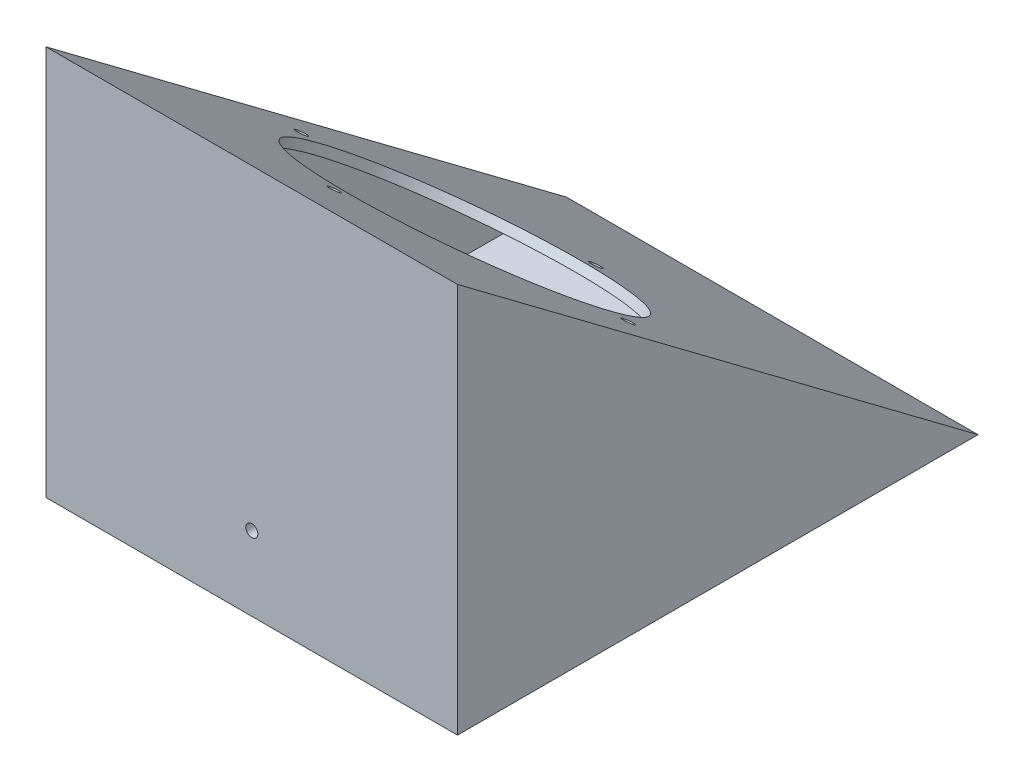
ISO-10303-21;
HEADER;
FILE_DESCRIPTION(('STEP AP214'),'2;1');
FILE_NAME('part.step','',(''),(''),'','','');
FILE_SCHEMA(('AUTOMOTIVE_DESIGN { 1 0 10303 214 1 1 1 1 }'));
ENDSEC;
DATA;
#1=APPLICATION_CONTEXT('core data for automotive mechanical design processes');
#2=APPLICATION_PROTOCOL_DEFINITION('international standard','automotive_design',2000,#1);
#3=PRODUCT_CONTEXT('',#1,'mechanical');
#4=PRODUCT('Part','Part','',(#3));
#5=PRODUCT_RELATED_PRODUCT_CATEGORY('part','',(#4));
#6=PRODUCT_DEFINITION_FORMATION('','',#4);
#7=PRODUCT_DEFINITION_CONTEXT('part definition',#1,'design');
#8=PRODUCT_DEFINITION('design','',#6,#7);
#9=PRODUCT_DEFINITION_SHAPE('','',#8);
#10=(LENGTH_UNIT() NAMED_UNIT(*) SI_UNIT(.MILLI.,.METRE.));
#11=(NAMED_UNIT(*) PLANE_ANGLE_UNIT() SI_UNIT($,.RADIAN.));
#12=(NAMED_UNIT(*) SI_UNIT($,.STERADIAN.) SOLID_ANGLE_UNIT());
#13=UNCERTAINTY_MEASURE_WITH_UNIT(LENGTH_MEASURE(1.E-05),#10,'distance_accuracy_value','');
#14=(GEOMETRIC_REPRESENTATION_CONTEXT(3) GLOBAL_UNCERTAINTY_ASSIGNED_CONTEXT((#13)) GLOBAL_UNIT_ASSIGNED_CONTEXT((#10,
#11,#12)) REPRESENTATION_CONTEXT('',''));
#15=CARTESIAN_POINT('',(0.,0.,0.));
#16=DIRECTION('',(0.,0.,1.));
#17=DIRECTION('',(1.,0.,0.));
#18=AXIS2_PLACEMENT_3D('',#15,#16,#17);
#19=CARTESIAN_POINT('',(130.,-3.,3.));
#20=DIRECTION('',(0.,0.,-1.));
#21=DIRECTION('',(0.,1.,0.));
#22=AXIS2_PLACEMENT_3D('',#19,#20,#21);
#23=PLANE('',#22);
#24=CARTESIAN_POINT('',(65.,21.560575419862,3.));
#25=DIRECTION('',(0.,0.,1.));
#26=DIRECTION('',(1.,0.,0.));
#27=AXIS2_PLACEMENT_3D('',#24,#25,#26);
#28=CIRCLE('',#27,2.);
#29=CARTESIAN_POINT('',(67.,21.560575419862,3.));
#30=VERTEX_POINT('',#29);
#31=EDGE_CURVE('E111',#30,#30,#28,.T.);
#32=ORIENTED_EDGE('',*,*,#31,.F.);
#33=EDGE_LOOP('',(#32));
#34=FACE_BOUND('',#33,.T.);
#35=DIRECTION('',(-1.,0.,0.));
#36=VECTOR('',#35,1.);
#37=CARTESIAN_POINT('',(130.,126.,3.));
#38=LINE('',#37,#36);
#39=CARTESIAN_POINT('',(133.,126.,3.));
#40=VERTEX_POINT('',#39);
#41=CARTESIAN_POINT('',(-3.,126.,3.));
#42=VERTEX_POINT('',#41);
#43=EDGE_CURVE('E98',#40,#42,#38,.T.);
#44=ORIENTED_EDGE('',*,*,#43,.T.);
#45=DIRECTION('',(0.,1.,0.));
#46=VECTOR('',#45,1.);
#47=CARTESIAN_POINT('',(-3.,126.,3.));
#48=LINE('',#47,#46);
#49=CARTESIAN_POINT('',(-3.,-3.,3.));
#50=VERTEX_POINT('',#49);
#51=EDGE_CURVE('E105',#50,#42,#48,.T.);
#52=ORIENTED_EDGE('',*,*,#51,.F.);
#53=DIRECTION('',(-1.,0.,0.));
#54=VECTOR('',#53,1.);
#55=CARTESIAN_POINT('',(130.,-3.,3.));
#56=LINE('',#55,#54);
#57=CARTESIAN_POINT('',(133.,-3.,3.));
#58=VERTEX_POINT('',#57);
#59=EDGE_CURVE('E11',#58,#50,#56,.T.);
#60=ORIENTED_EDGE('',*,*,#59,.F.);
#61=DIRECTION('',(0.,-1.,0.));
#62=VECTOR('',#61,1.);
#63=CARTESIAN_POINT('',(133.,-3.,3.));
#64=LINE('',#63,#62);
#65=EDGE_CURVE('E119',#40,#58,#64,.T.);
#66=ORIENTED_EDGE('',*,*,#65,.F.);
#67=EDGE_LOOP('',(#44,#52,#60,#66));
#68=FACE_BOUND('',#67,.T.);
#69=ADVANCED_FACE('F33',(#34,#68),#23,.F.);
#70=CARTESIAN_POINT('',(130.,-3.,3.));
#71=DIRECTION('',(0.,1.,0.));
#72=DIRECTION('',(0.,0.,1.));
#73=AXIS2_PLACEMENT_3D('',#70,#71,#72);
#74=PLANE('',#73);
#75=ORIENTED_EDGE('',*,*,#59,.T.);
#76=DIRECTION('',(0.,0.,1.));
#77=VECTOR('',#76,1.);
#78=CARTESIAN_POINT('',(-3.,-3.,3.));
#79=LINE('',#78,#77);
#80=CARTESIAN_POINT('',(-3.,-3.,-169.));
#81=VERTEX_POINT('',#80);
#82=EDGE_CURVE('E100',#81,#50,#79,.T.);
#83=ORIENTED_EDGE('',*,*,#82,.F.);
#84=DIRECTION('',(-1.,0.,0.));
#85=VECTOR('',#84,1.);
#86=CARTESIAN_POINT('',(130.,-3.,-169.));
#87=LINE('',#86,#85);
#88=CARTESIAN_POINT('',(133.,-3.,-169.));
#89=VERTEX_POINT('',#88);
#90=EDGE_CURVE('E41',#89,#81,#87,.T.);
#91=ORIENTED_EDGE('',*,*,#90,.F.);
#92=DIRECTION('',(0.,0.,-1.));
#93=VECTOR('',#92,1.);
#94=CARTESIAN_POINT('',(133.,-3.,-169.));
#95=LINE('',#94,#93);
#96=EDGE_CURVE('E116',#58,#89,#95,.T.);
#97=ORIENTED_EDGE('',*,*,#96,.F.);
#98=EDGE_LOOP('',(#75,#83,#91,#97));
#99=FACE_BOUND('',#98,.T.);
#100=ADVANCED_FACE('F101',(#99),#74,.F.);
#101=CARTESIAN_POINT('',(130.,126.,3.));
#102=DIRECTION('',(0.,-0.8,0.6));
#103=DIRECTION('',(0.,-0.6,-0.8));
#104=AXIS2_PLACEMENT_3D('',#101,#102,#103);
#105=PLANE('',#104);
#106=CARTESIAN_POINT('',(11.,73.2,-67.4));
#107=DIRECTION('',(0.,0.8,-0.6));
#108=DIRECTION('',(0.,0.6,0.8));
#109=AXIS2_PLACEMENT_3D('',#106,#107,#108);
#110=CIRCLE('',#109,1.9);
#111=CARTESIAN_POINT('',(11.,74.34,-65.88));
#112=VERTEX_POINT('',#111);
#113=EDGE_CURVE('E127',#112,#112,#110,.T.);
#114=ORIENTED_EDGE('',*,*,#113,.F.);
#115=EDGE_LOOP('',(#114));
#116=FACE_BOUND('',#115,.T.);
#117=CARTESIAN_POINT('',(65.,40.8,-110.6));
#118=DIRECTION('',(0.,0.8,-0.6));
#119=DIRECTION('',(0.,0.6,0.8));
#120=AXIS2_PLACEMENT_3D('',#117,#118,#119);
#121=CIRCLE('',#120,1.9);
#122=CARTESIAN_POINT('',(65.,41.94,-109.08));
#123=VERTEX_POINT('',#122);
#124=EDGE_CURVE('E133',#123,#123,#121,.T.);
#125=ORIENTED_EDGE('',*,*,#124,.F.);
#126=EDGE_LOOP('',(#125));
#127=FACE_BOUND('',#126,.T.);
#128=CARTESIAN_POINT('',(119.,73.2,-67.4));
#129=DIRECTION('',(0.,0.8,-0.6));
#130=DIRECTION('',(0.,0.6,0.8));
#131=AXIS2_PLACEMENT_3D('',#128,#129,#130);
#132=CIRCLE('',#131,1.9);
#133=CARTESIAN_POINT('',(119.,74.34,-65.88));
#134=VERTEX_POINT('',#133);
#135=EDGE_CURVE('E122',#134,#134,#132,.T.);
#136=ORIENTED_EDGE('',*,*,#135,.F.);
#137=EDGE_LOOP('',(#136));
#138=FACE_BOUND('',#137,.T.);
#139=CARTESIAN_POINT('',(65.,105.6,-24.2));
#140=DIRECTION('',(0.,0.8,-0.6));
#141=DIRECTION('',(0.,0.6,0.8));
#142=AXIS2_PLACEMENT_3D('',#139,#140,#141);
#143=CIRCLE('',#142,1.9);
#144=CARTESIAN_POINT('',(65.,106.74,-22.68));
#145=VERTEX_POINT('',#144);
#146=EDGE_CURVE('E126',#145,#145,#143,.T.);
#147=ORIENTED_EDGE('',*,*,#146,.F.);
#148=EDGE_LOOP('',(#147));
#149=FACE_BOUND('',#148,.T.);
#150=CARTESIAN_POINT('',(65.,73.2,-67.4));
#151=DIRECTION('',(0.,0.8,-0.6));
#152=DIRECTION('',(0.,0.6,0.8));
#153=AXIS2_PLACEMENT_3D('',#150,#151,#152);
#154=CIRCLE('',#153,48.);
#155=CARTESIAN_POINT('',(65.,102.,-29.));
#156=VERTEX_POINT('',#155);
#157=EDGE_CURVE('E144',#156,#156,#154,.T.);
#158=ORIENTED_EDGE('',*,*,#157,.F.);
#159=EDGE_LOOP('',(#158));
#160=FACE_BOUND('',#159,.T.);
#161=ORIENTED_EDGE('',*,*,#90,.T.);
#162=DIRECTION('',(0.,-0.6,-0.8));
#163=VECTOR('',#162,1.);
#164=CARTESIAN_POINT('',(-3.,-3.,-169.));
#165=LINE('',#164,#163);
#166=EDGE_CURVE('E92',#42,#81,#165,.T.);
#167=ORIENTED_EDGE('',*,*,#166,.F.);
#168=ORIENTED_EDGE('',*,*,#43,.F.);
#169=DIRECTION('',(0.,0.6,0.8));
#170=VECTOR('',#169,1.);
#171=CARTESIAN_POINT('',(133.,126.,3.));
#172=LINE('',#171,#170);
#173=EDGE_CURVE('E94',#89,#40,#172,.T.);
#174=ORIENTED_EDGE('',*,*,#173,.F.);
#175=EDGE_LOOP('',(#161,#167,#168,#174));
#176=FACE_BOUND('',#175,.T.);
#177=ADVANCED_FACE('F90',(#116,#127,#138,#149,#160,#176),#105,.F.);
#178=CARTESIAN_POINT('',(130.,0.,0.));
#179=DIRECTION('',(0.,0.,-1.));
#180=DIRECTION('',(-1.,0.,0.));
#181=AXIS2_PLACEMENT_3D('',#178,#179,#180);
#182=PLANE('',#181);
#183=CARTESIAN_POINT('',(65.,21.560575419862,0.));
#184=DIRECTION('',(0.,0.,1.));
#185=DIRECTION('',(1.,0.,0.));
#186=AXIS2_PLACEMENT_3D('',#183,#184,#185);
#187=CIRCLE('',#186,2.);
#188=CARTESIAN_POINT('',(67.,21.560575419862,0.));
#189=VERTEX_POINT('',#188);
#190=EDGE_CURVE('E108',#189,#189,#187,.T.);
#191=ORIENTED_EDGE('',*,*,#190,.T.);
#192=EDGE_LOOP('',(#191));
#193=FACE_BOUND('',#192,.T.);
#194=DIRECTION('',(0.,-1.,0.));
#195=VECTOR('',#194,1.);
#196=CARTESIAN_POINT('',(0.,0.,0.));
#197=LINE('',#196,#195);
#198=CARTESIAN_POINT('',(0.,120.,0.));
#199=VERTEX_POINT('',#198);
#200=CARTESIAN_POINT('',(0.,0.,0.));
#201=VERTEX_POINT('',#200);
#202=EDGE_CURVE('E150',#199,#201,#197,.T.);
#203=ORIENTED_EDGE('',*,*,#202,.F.);
#204=DIRECTION('',(-1.,0.,0.));
#205=VECTOR('',#204,1.);
#206=CARTESIAN_POINT('',(130.,120.,0.));
#207=LINE('',#206,#205);
#208=CARTESIAN_POINT('',(130.,120.,0.));
#209=VERTEX_POINT('',#208);
#210=EDGE_CURVE('E157',#209,#199,#207,.T.);
#211=ORIENTED_EDGE('',*,*,#210,.F.);
#212=DIRECTION('',(0.,-1.,0.));
#213=VECTOR('',#212,1.);
#214=CARTESIAN_POINT('',(130.,0.,0.));
#215=LINE('',#214,#213);
#216=CARTESIAN_POINT('',(130.,0.,0.));
#217=VERTEX_POINT('',#216);
#218=EDGE_CURVE('E48',#209,#217,#215,.T.);
#219=ORIENTED_EDGE('',*,*,#218,.T.);
#220=DIRECTION('',(-1.,0.,0.));
#221=VECTOR('',#220,1.);
#222=CARTESIAN_POINT('',(130.,0.,0.));
#223=LINE('',#222,#221);
#224=EDGE_CURVE('E166',#217,#201,#223,.T.);
#225=ORIENTED_EDGE('',*,*,#224,.T.);
#226=EDGE_LOOP('',(#203,#211,#219,#225));
#227=FACE_BOUND('',#226,.T.);
#228=ADVANCED_FACE('F202',(#193,#227),#182,.T.);
#229=CARTESIAN_POINT('',(130.,0.,0.));
#230=DIRECTION('',(0.,1.,0.));
#231=DIRECTION('',(0.,0.,1.));
#232=AXIS2_PLACEMENT_3D('',#229,#230,#231);
#233=PLANE('',#232);
#234=DIRECTION('',(0.,0.,-1.));
#235=VECTOR('',#234,1.);
#236=CARTESIAN_POINT('',(0.,0.,0.));
#237=LINE('',#236,#235);
#238=CARTESIAN_POINT('',(0.,0.,-160.));
#239=VERTEX_POINT('',#238);
#240=EDGE_CURVE('E59',#201,#239,#237,.T.);
#241=ORIENTED_EDGE('',*,*,#240,.F.);
#242=ORIENTED_EDGE('',*,*,#224,.F.);
#243=DIRECTION('',(0.,0.,-1.));
#244=VECTOR('',#243,1.);
#245=CARTESIAN_POINT('',(130.,0.,0.));
#246=LINE('',#245,#244);
#247=CARTESIAN_POINT('',(130.,0.,-160.));
#248=VERTEX_POINT('',#247);
#249=EDGE_CURVE('E63',#217,#248,#246,.T.);
#250=ORIENTED_EDGE('',*,*,#249,.T.);
#251=DIRECTION('',(-1.,0.,0.));
#252=VECTOR('',#251,1.);
#253=CARTESIAN_POINT('',(130.,0.,-160.));
#254=LINE('',#253,#252);
#255=EDGE_CURVE('E164',#248,#239,#254,.T.);
#256=ORIENTED_EDGE('',*,*,#255,.T.);
#257=EDGE_LOOP('',(#241,#242,#250,#256));
#258=FACE_BOUND('',#257,.T.);
#259=ADVANCED_FACE('F205',(#258),#233,.T.);
#260=CARTESIAN_POINT('',(130.,120.,0.));
#261=DIRECTION('',(0.,-0.8,0.6));
#262=DIRECTION('',(0.,-0.6,-0.8));
#263=AXIS2_PLACEMENT_3D('',#260,#261,#262);
#264=PLANE('',#263);
#265=CARTESIAN_POINT('',(11.,70.8,-65.6));
#266=DIRECTION('',(0.,0.8,-0.6));
#267=DIRECTION('',(0.,0.6,0.8));
#268=AXIS2_PLACEMENT_3D('',#265,#266,#267);
#269=CIRCLE('',#268,1.9);
#270=CARTESIAN_POINT('',(11.,71.94,-64.08));
#271=VERTEX_POINT('',#270);
#272=EDGE_CURVE('E123',#271,#271,#269,.T.);
#273=ORIENTED_EDGE('',*,*,#272,.T.);
#274=EDGE_LOOP('',(#273));
#275=FACE_BOUND('',#274,.T.);
#276=CARTESIAN_POINT('',(65.,38.4,-108.8));
#277=DIRECTION('',(0.,0.8,-0.6));
#278=DIRECTION('',(0.,0.6,0.8));
#279=AXIS2_PLACEMENT_3D('',#276,#277,#278);
#280=CIRCLE('',#279,1.9);
#281=CARTESIAN_POINT('',(65.,39.54,-107.28));
#282=VERTEX_POINT('',#281);
#283=EDGE_CURVE('E130',#282,#282,#280,.T.);
#284=ORIENTED_EDGE('',*,*,#283,.T.);
#285=EDGE_LOOP('',(#284));
#286=FACE_BOUND('',#285,.T.);
#287=CARTESIAN_POINT('',(119.,70.8,-65.6));
#288=DIRECTION('',(0.,0.8,-0.6));
#289=DIRECTION('',(0.,0.6,0.8));
#290=AXIS2_PLACEMENT_3D('',#287,#288,#289);
#291=CIRCLE('',#290,1.9);
#292=CARTESIAN_POINT('',(119.,71.94,-64.08));
#293=VERTEX_POINT('',#292);
#294=EDGE_CURVE('E136',#293,#293,#291,.T.);
#295=ORIENTED_EDGE('',*,*,#294,.T.);
#296=EDGE_LOOP('',(#295));
#297=FACE_BOUND('',#296,.T.);
#298=CARTESIAN_POINT('',(65.,103.2,-22.4));
#299=DIRECTION('',(0.,0.8,-0.6));
#300=DIRECTION('',(0.,0.6,0.8));
#301=AXIS2_PLACEMENT_3D('',#298,#299,#300);
#302=CIRCLE('',#301,1.9);
#303=CARTESIAN_POINT('',(65.,104.34,-20.88));
#304=VERTEX_POINT('',#303);
#305=EDGE_CURVE('E141',#304,#304,#302,.T.);
#306=ORIENTED_EDGE('',*,*,#305,.T.);
#307=EDGE_LOOP('',(#306));
#308=FACE_BOUND('',#307,.T.);
#309=CARTESIAN_POINT('',(65.,70.8,-65.6));
#310=DIRECTION('',(0.,0.8,-0.6));
#311=DIRECTION('',(0.,0.6,0.8));
#312=AXIS2_PLACEMENT_3D('',#309,#310,#311);
#313=CIRCLE('',#312,48.);
#314=CARTESIAN_POINT('',(65.,99.6,-27.2));
#315=VERTEX_POINT('',#314);
#316=EDGE_CURVE('E147',#315,#315,#313,.T.);
#317=ORIENTED_EDGE('',*,*,#316,.T.);
#318=EDGE_LOOP('',(#317));
#319=FACE_BOUND('',#318,.T.);
#320=DIRECTION('',(0.,0.6,0.8));
#321=VECTOR('',#320,1.);
#322=CARTESIAN_POINT('',(0.,120.,0.));
#323=LINE('',#322,#321);
#324=EDGE_CURVE('E154',#239,#199,#323,.T.);
#325=ORIENTED_EDGE('',*,*,#324,.F.);
#326=ORIENTED_EDGE('',*,*,#255,.F.);
#327=DIRECTION('',(0.,0.6,0.8));
#328=VECTOR('',#327,1.);
#329=CARTESIAN_POINT('',(130.,120.,0.));
#330=LINE('',#329,#328);
#331=EDGE_CURVE('E65',#248,#209,#330,.T.);
#332=ORIENTED_EDGE('',*,*,#331,.T.);
#333=ORIENTED_EDGE('',*,*,#210,.T.);
#334=EDGE_LOOP('',(#325,#326,#332,#333));
#335=FACE_BOUND('',#334,.T.);
#336=ADVANCED_FACE('F211',(#275,#286,#297,#308,#319,#335),#264,.T.);
#337=CARTESIAN_POINT('',(65.,70.8,-65.6));
#338=DIRECTION('',(0.,0.8,-0.6));
#339=DIRECTION('',(0.,0.6,0.8));
#340=AXIS2_PLACEMENT_3D('',#337,#338,#339);
#341=CYLINDRICAL_SURFACE('',#340,48.);
#342=ORIENTED_EDGE('',*,*,#316,.F.);
#343=EDGE_LOOP('',(#342));
#344=FACE_BOUND('',#343,.T.);
#345=ORIENTED_EDGE('',*,*,#157,.T.);
#346=EDGE_LOOP('',(#345));
#347=FACE_BOUND('',#346,.T.);
#348=ADVANCED_FACE('F217',(#344,#347),#341,.F.);
#349=CARTESIAN_POINT('',(65.,103.2,-22.4));
#350=DIRECTION('',(0.,0.8,-0.6));
#351=DIRECTION('',(0.,0.6,0.8));
#352=AXIS2_PLACEMENT_3D('',#349,#350,#351);
#353=CYLINDRICAL_SURFACE('',#352,1.9);
#354=ORIENTED_EDGE('',*,*,#305,.F.);
#355=EDGE_LOOP('',(#354));
#356=FACE_BOUND('',#355,.T.);
#357=ORIENTED_EDGE('',*,*,#146,.T.);
#358=EDGE_LOOP('',(#357));
#359=FACE_BOUND('',#358,.T.);
#360=ADVANCED_FACE('F237',(#356,#359),#353,.F.);
#361=CARTESIAN_POINT('',(119.,70.8,-65.6));
#362=DIRECTION('',(0.,0.8,-0.6));
#363=DIRECTION('',(0.,0.6,0.8));
#364=AXIS2_PLACEMENT_3D('',#361,#362,#363);
#365=CYLINDRICAL_SURFACE('',#364,1.9);
#366=ORIENTED_EDGE('',*,*,#294,.F.);
#367=EDGE_LOOP('',(#366));
#368=FACE_BOUND('',#367,.T.);
#369=ORIENTED_EDGE('',*,*,#135,.T.);
#370=EDGE_LOOP('',(#369));
#371=FACE_BOUND('',#370,.T.);
#372=ADVANCED_FACE('F242',(#368,#371),#365,.F.);
#373=CARTESIAN_POINT('',(65.,38.4,-108.8));
#374=DIRECTION('',(0.,0.8,-0.6));
#375=DIRECTION('',(0.,0.6,0.8));
#376=AXIS2_PLACEMENT_3D('',#373,#374,#375);
#377=CYLINDRICAL_SURFACE('',#376,1.9);
#378=ORIENTED_EDGE('',*,*,#283,.F.);
#379=EDGE_LOOP('',(#378));
#380=FACE_BOUND('',#379,.T.);
#381=ORIENTED_EDGE('',*,*,#124,.T.);
#382=EDGE_LOOP('',(#381));
#383=FACE_BOUND('',#382,.T.);
#384=ADVANCED_FACE('F249',(#380,#383),#377,.F.);
#385=CARTESIAN_POINT('',(11.,70.8,-65.6));
#386=DIRECTION('',(0.,0.8,-0.6));
#387=DIRECTION('',(0.,0.6,0.8));
#388=AXIS2_PLACEMENT_3D('',#385,#386,#387);
#389=CYLINDRICAL_SURFACE('',#388,1.9);
#390=ORIENTED_EDGE('',*,*,#272,.F.);
#391=EDGE_LOOP('',(#390));
#392=FACE_BOUND('',#391,.T.);
#393=ORIENTED_EDGE('',*,*,#113,.T.);
#394=EDGE_LOOP('',(#393));
#395=FACE_BOUND('',#394,.T.);
#396=ADVANCED_FACE('F182',(#392,#395),#389,.F.);
#397=CARTESIAN_POINT('',(130.,0.,0.));
#398=DIRECTION('',(-1.,0.,0.));
#399=DIRECTION('',(0.,0.,1.));
#400=AXIS2_PLACEMENT_3D('',#397,#398,#399);
#401=PLANE('',#400);
#402=ORIENTED_EDGE('',*,*,#249,.F.);
#403=ORIENTED_EDGE('',*,*,#218,.F.);
#404=ORIENTED_EDGE('',*,*,#331,.F.);
#405=EDGE_LOOP('',(#402,#403,#404));
#406=FACE_BOUND('',#405,.T.);
#407=ADVANCED_FACE('F174',(#406),#401,.T.);
#408=CARTESIAN_POINT('',(133.,0.,0.));
#409=DIRECTION('',(-1.,0.,0.));
#410=DIRECTION('',(0.,0.,1.));
#411=AXIS2_PLACEMENT_3D('',#408,#409,#410);
#412=PLANE('',#411);
#413=ORIENTED_EDGE('',*,*,#96,.T.);
#414=ORIENTED_EDGE('',*,*,#173,.T.);
#415=ORIENTED_EDGE('',*,*,#65,.T.);
#416=EDGE_LOOP('',(#413,#414,#415));
#417=FACE_BOUND('',#416,.T.);
#418=ADVANCED_FACE('F171',(#417),#412,.F.);
#419=CARTESIAN_POINT('',(0.,0.,0.));
#420=DIRECTION('',(1.,0.,0.));
#421=DIRECTION('',(0.,0.,-1.));
#422=AXIS2_PLACEMENT_3D('',#419,#420,#421);
#423=PLANE('',#422);
#424=ORIENTED_EDGE('',*,*,#324,.T.);
#425=ORIENTED_EDGE('',*,*,#202,.T.);
#426=ORIENTED_EDGE('',*,*,#240,.T.);
#427=EDGE_LOOP('',(#424,#425,#426));
#428=FACE_BOUND('',#427,.T.);
#429=ADVANCED_FACE('F173',(#428),#423,.T.);
#430=CARTESIAN_POINT('',(-3.,0.,0.));
#431=DIRECTION('',(1.,0.,0.));
#432=DIRECTION('',(0.,0.,-1.));
#433=AXIS2_PLACEMENT_3D('',#430,#431,#432);
#434=PLANE('',#433);
#435=ORIENTED_EDGE('',*,*,#166,.T.);
#436=ORIENTED_EDGE('',*,*,#82,.T.);
#437=ORIENTED_EDGE('',*,*,#51,.T.);
#438=EDGE_LOOP('',(#435,#436,#437));
#439=FACE_BOUND('',#438,.T.);
#440=ADVANCED_FACE('F107',(#439),#434,.F.);
#441=CARTESIAN_POINT('',(65.,21.560575419862,0.));
#442=DIRECTION('',(0.,0.,1.));
#443=DIRECTION('',(1.,0.,0.));
#444=AXIS2_PLACEMENT_3D('',#441,#442,#443);
#445=CYLINDRICAL_SURFACE('',#444,2.);
#446=ORIENTED_EDGE('',*,*,#190,.F.);
#447=EDGE_LOOP('',(#446));
#448=FACE_BOUND('',#447,.T.);
#449=ORIENTED_EDGE('',*,*,#31,.T.);
#450=EDGE_LOOP('',(#449));
#451=FACE_BOUND('',#450,.T.);
#452=ADVANCED_FACE('F192',(#448,#451),#445,.F.);
#453=CLOSED_SHELL('',(#69,#100,#177,#228,#259,#336,#348,#360,#372,#384,#396,#407,#418,#429,#440,#452));
#454=MANIFOLD_SOLID_BREP('B2',#453);
#455=ADVANCED_BREP_SHAPE_REPRESENTATION('',(#18,#454),#14);
#456=SHAPE_DEFINITION_REPRESENTATION(#9,#455);
ENDSEC;
END-ISO-10303-21;
